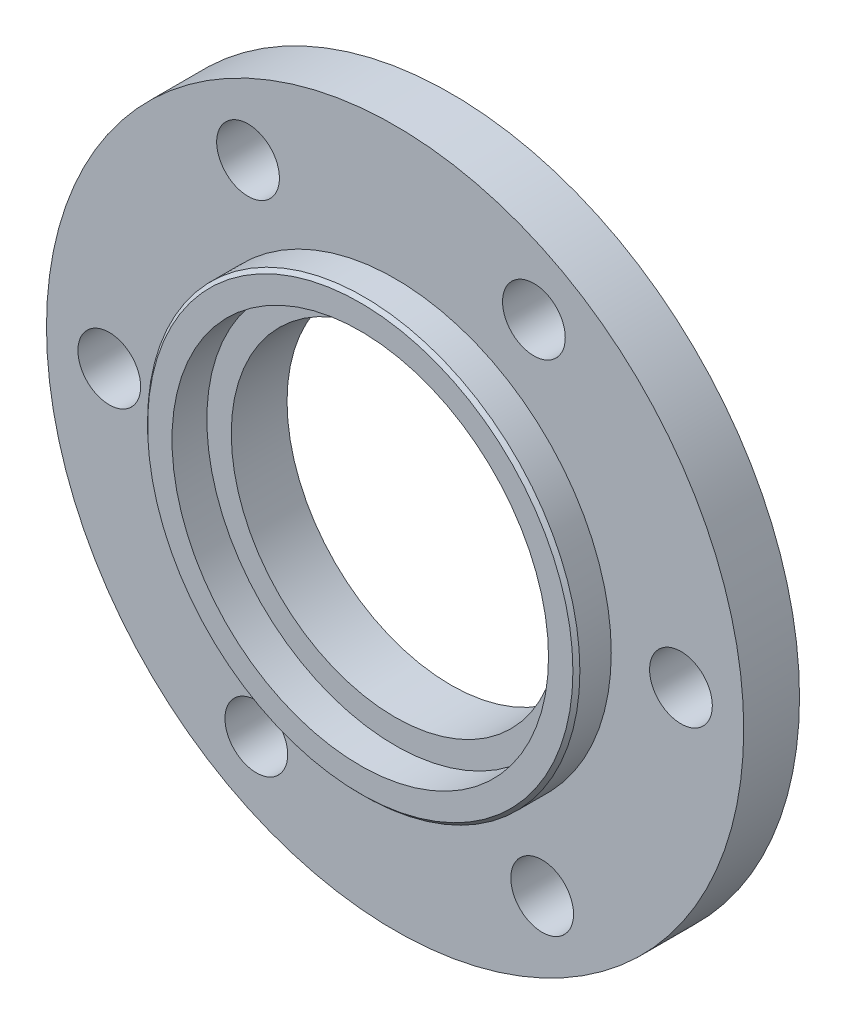
ISO-10303-21;
HEADER;
FILE_DESCRIPTION(('STEP AP214'),'2;1');
FILE_NAME('part.step','',(''),(''),'','','');
FILE_SCHEMA(('AUTOMOTIVE_DESIGN { 1 0 10303 214 1 1 1 1 }'));
ENDSEC;
DATA;
#1=APPLICATION_CONTEXT('core data for automotive mechanical design processes');
#2=APPLICATION_PROTOCOL_DEFINITION('international standard','automotive_design',2000,#1);
#3=PRODUCT_CONTEXT('',#1,'mechanical');
#4=PRODUCT('Part','Part','',(#3));
#5=PRODUCT_RELATED_PRODUCT_CATEGORY('part','',(#4));
#6=PRODUCT_DEFINITION_FORMATION('','',#4);
#7=PRODUCT_DEFINITION_CONTEXT('part definition',#1,'design');
#8=PRODUCT_DEFINITION('design','',#6,#7);
#9=PRODUCT_DEFINITION_SHAPE('','',#8);
#10=(LENGTH_UNIT() NAMED_UNIT(*) SI_UNIT(.MILLI.,.METRE.));
#11=(NAMED_UNIT(*) PLANE_ANGLE_UNIT() SI_UNIT($,.RADIAN.));
#12=(NAMED_UNIT(*) SI_UNIT($,.STERADIAN.) SOLID_ANGLE_UNIT());
#13=UNCERTAINTY_MEASURE_WITH_UNIT(LENGTH_MEASURE(1.E-05),#10,'distance_accuracy_value','');
#14=(GEOMETRIC_REPRESENTATION_CONTEXT(3) GLOBAL_UNCERTAINTY_ASSIGNED_CONTEXT((#13)) GLOBAL_UNIT_ASSIGNED_CONTEXT((#10,
#11,#12)) REPRESENTATION_CONTEXT('',''));
#15=CARTESIAN_POINT('',(0.,0.,0.));
#16=DIRECTION('',(0.,0.,1.));
#17=DIRECTION('',(1.,0.,0.));
#18=AXIS2_PLACEMENT_3D('',#15,#16,#17);
#19=CARTESIAN_POINT('',(0.,0.,8.));
#20=DIRECTION('',(0.,0.,-1.));
#21=DIRECTION('',(-1.,0.,0.));
#22=AXIS2_PLACEMENT_3D('',#19,#20,#21);
#23=CYLINDRICAL_SURFACE('',#22,50.);
#24=CARTESIAN_POINT('',(0.,0.,8.));
#25=DIRECTION('',(0.,0.,1.));
#26=DIRECTION('',(1.,0.,0.));
#27=AXIS2_PLACEMENT_3D('',#24,#25,#26);
#28=CIRCLE('',#27,50.);
#29=CARTESIAN_POINT('',(50.,0.,8.));
#30=VERTEX_POINT('',#29);
#31=EDGE_CURVE('E55',#30,#30,#28,.T.);
#32=ORIENTED_EDGE('',*,*,#31,.F.);
#33=EDGE_LOOP('',(#32));
#34=FACE_BOUND('',#33,.T.);
#35=CARTESIAN_POINT('',(0.,0.,0.));
#36=DIRECTION('',(0.,0.,1.));
#37=DIRECTION('',(1.,0.,0.));
#38=AXIS2_PLACEMENT_3D('',#35,#36,#37);
#39=CIRCLE('',#38,50.);
#40=CARTESIAN_POINT('',(50.,0.,0.));
#41=VERTEX_POINT('',#40);
#42=EDGE_CURVE('E58',#41,#41,#39,.T.);
#43=ORIENTED_EDGE('',*,*,#42,.T.);
#44=EDGE_LOOP('',(#43));
#45=FACE_BOUND('',#44,.T.);
#46=ADVANCED_FACE('F39',(#34,#45),#23,.T.);
#47=CARTESIAN_POINT('',(0.,0.,8.));
#48=DIRECTION('',(0.,0.,1.));
#49=DIRECTION('',(1.,0.,0.));
#50=AXIS2_PLACEMENT_3D('',#47,#48,#49);
#51=PLANE('',#50);
#52=CARTESIAN_POINT('',(40.9942813374193,0.684761001017027,8.));
#53=DIRECTION('',(0.,0.,1.));
#54=DIRECTION('',(1.,0.,0.));
#55=AXIS2_PLACEMENT_3D('',#52,#53,#54);
#56=CIRCLE('',#55,4.5);
#57=CARTESIAN_POINT('',(45.4942813374193,0.684761001017027,8.));
#58=VERTEX_POINT('',#57);
#59=EDGE_CURVE('E101',#58,#58,#56,.T.);
#60=ORIENTED_EDGE('',*,*,#59,.F.);
#61=EDGE_LOOP('',(#60));
#62=FACE_BOUND('',#61,.T.);
#63=CARTESIAN_POINT('',(19.9041202463085,35.8444695485997,8.));
#64=DIRECTION('',(0.,0.,1.));
#65=DIRECTION('',(1.,0.,0.));
#66=AXIS2_PLACEMENT_3D('',#63,#64,#65);
#67=CIRCLE('',#66,4.50000000000001);
#68=CARTESIAN_POINT('',(24.4041202463085,35.8444695485997,8.));
#69=VERTEX_POINT('',#68);
#70=EDGE_CURVE('E80',#69,#69,#67,.T.);
#71=ORIENTED_EDGE('',*,*,#70,.F.);
#72=EDGE_LOOP('',(#71));
#73=FACE_BOUND('',#72,.T.);
#74=CARTESIAN_POINT('',(-21.0901610911109,35.1597085475831,8.));
#75=DIRECTION('',(0.,0.,1.));
#76=DIRECTION('',(1.,0.,0.));
#77=AXIS2_PLACEMENT_3D('',#74,#75,#76);
#78=CIRCLE('',#77,4.5);
#79=CARTESIAN_POINT('',(-16.5901610911109,35.1597085475831,8.));
#80=VERTEX_POINT('',#79);
#81=EDGE_CURVE('E79',#80,#80,#78,.T.);
#82=ORIENTED_EDGE('',*,*,#81,.F.);
#83=EDGE_LOOP('',(#82));
#84=FACE_BOUND('',#83,.T.);
#85=CARTESIAN_POINT('',(-40.9942813374193,-0.684761001016741,8.));
#86=DIRECTION('',(0.,0.,1.));
#87=DIRECTION('',(1.,0.,0.));
#88=AXIS2_PLACEMENT_3D('',#85,#86,#87);
#89=CIRCLE('',#88,4.5);
#90=CARTESIAN_POINT('',(-36.4942813374193,-0.684761001016741,8.));
#91=VERTEX_POINT('',#90);
#92=EDGE_CURVE('E86',#91,#91,#89,.T.);
#93=ORIENTED_EDGE('',*,*,#92,.F.);
#94=EDGE_LOOP('',(#93));
#95=FACE_BOUND('',#94,.T.);
#96=CARTESIAN_POINT('',(-19.9041202463082,-35.8444695485999,8.));
#97=DIRECTION('',(0.,0.,1.));
#98=DIRECTION('',(1.,0.,0.));
#99=AXIS2_PLACEMENT_3D('',#96,#97,#98);
#100=CIRCLE('',#99,4.50000000000001);
#101=CARTESIAN_POINT('',(-15.4041202463082,-35.8444695485999,8.));
#102=VERTEX_POINT('',#101);
#103=EDGE_CURVE('E92',#102,#102,#100,.T.);
#104=ORIENTED_EDGE('',*,*,#103,.F.);
#105=EDGE_LOOP('',(#104));
#106=FACE_BOUND('',#105,.T.);
#107=CARTESIAN_POINT('',(21.0901610911112,-35.159708547583,8.));
#108=DIRECTION('',(0.,0.,1.));
#109=DIRECTION('',(1.,0.,0.));
#110=AXIS2_PLACEMENT_3D('',#107,#108,#109);
#111=CIRCLE('',#110,4.50000000000001);
#112=CARTESIAN_POINT('',(25.5901610911112,-35.159708547583,8.));
#113=VERTEX_POINT('',#112);
#114=EDGE_CURVE('E98',#113,#113,#111,.T.);
#115=ORIENTED_EDGE('',*,*,#114,.F.);
#116=EDGE_LOOP('',(#115));
#117=FACE_BOUND('',#116,.T.);
#118=CARTESIAN_POINT('',(0.,0.,8.));
#119=DIRECTION('',(0.,0.,1.));
#120=DIRECTION('',(1.,0.,0.));
#121=AXIS2_PLACEMENT_3D('',#118,#119,#120);
#122=CIRCLE('',#121,31.);
#123=CARTESIAN_POINT('',(31.,0.,8.));
#124=VERTEX_POINT('',#123);
#125=EDGE_CURVE('E51',#124,#124,#122,.T.);
#126=ORIENTED_EDGE('',*,*,#125,.F.);
#127=EDGE_LOOP('',(#126));
#128=FACE_BOUND('',#127,.T.);
#129=ORIENTED_EDGE('',*,*,#31,.T.);
#130=EDGE_LOOP('',(#129));
#131=FACE_BOUND('',#130,.T.);
#132=ADVANCED_FACE('F122',(#62,#73,#84,#95,#106,#117,#128,#131),#51,.T.);
#133=CARTESIAN_POINT('',(0.,0.,0.));
#134=DIRECTION('',(0.,0.,1.));
#135=DIRECTION('',(1.,0.,0.));
#136=AXIS2_PLACEMENT_3D('',#133,#134,#135);
#137=PLANE('',#136);
#138=CARTESIAN_POINT('',(40.9942813374193,0.684761001017027,0.));
#139=DIRECTION('',(0.,0.,1.));
#140=DIRECTION('',(1.,0.,0.));
#141=AXIS2_PLACEMENT_3D('',#138,#139,#140);
#142=CIRCLE('',#141,4.5);
#143=CARTESIAN_POINT('',(45.4942813374193,0.684761001017027,0.));
#144=VERTEX_POINT('',#143);
#145=EDGE_CURVE('E73',#144,#144,#142,.T.);
#146=ORIENTED_EDGE('',*,*,#145,.T.);
#147=EDGE_LOOP('',(#146));
#148=FACE_BOUND('',#147,.T.);
#149=CARTESIAN_POINT('',(19.9041202463085,35.8444695485997,0.));
#150=DIRECTION('',(0.,0.,1.));
#151=DIRECTION('',(1.,0.,0.));
#152=AXIS2_PLACEMENT_3D('',#149,#150,#151);
#153=CIRCLE('',#152,4.50000000000001);
#154=CARTESIAN_POINT('',(24.4041202463085,35.8444695485997,0.));
#155=VERTEX_POINT('',#154);
#156=EDGE_CURVE('E102',#155,#155,#153,.T.);
#157=ORIENTED_EDGE('',*,*,#156,.T.);
#158=EDGE_LOOP('',(#157));
#159=FACE_BOUND('',#158,.T.);
#160=CARTESIAN_POINT('',(-21.0901610911109,35.1597085475831,0.));
#161=DIRECTION('',(0.,0.,1.));
#162=DIRECTION('',(1.,0.,0.));
#163=AXIS2_PLACEMENT_3D('',#160,#161,#162);
#164=CIRCLE('',#163,4.5);
#165=CARTESIAN_POINT('',(-16.5901610911109,35.1597085475831,0.));
#166=VERTEX_POINT('',#165);
#167=EDGE_CURVE('E76',#166,#166,#164,.T.);
#168=ORIENTED_EDGE('',*,*,#167,.T.);
#169=EDGE_LOOP('',(#168));
#170=FACE_BOUND('',#169,.T.);
#171=CARTESIAN_POINT('',(-40.9942813374193,-0.684761001016741,0.));
#172=DIRECTION('',(0.,0.,1.));
#173=DIRECTION('',(1.,0.,0.));
#174=AXIS2_PLACEMENT_3D('',#171,#172,#173);
#175=CIRCLE('',#174,4.5);
#176=CARTESIAN_POINT('',(-36.4942813374193,-0.684761001016741,0.));
#177=VERTEX_POINT('',#176);
#178=EDGE_CURVE('E83',#177,#177,#175,.T.);
#179=ORIENTED_EDGE('',*,*,#178,.T.);
#180=EDGE_LOOP('',(#179));
#181=FACE_BOUND('',#180,.T.);
#182=CARTESIAN_POINT('',(-19.9041202463082,-35.8444695485999,0.));
#183=DIRECTION('',(0.,0.,1.));
#184=DIRECTION('',(1.,0.,0.));
#185=AXIS2_PLACEMENT_3D('',#182,#183,#184);
#186=CIRCLE('',#185,4.50000000000001);
#187=CARTESIAN_POINT('',(-15.4041202463082,-35.8444695485999,0.));
#188=VERTEX_POINT('',#187);
#189=EDGE_CURVE('E89',#188,#188,#186,.T.);
#190=ORIENTED_EDGE('',*,*,#189,.T.);
#191=EDGE_LOOP('',(#190));
#192=FACE_BOUND('',#191,.T.);
#193=CARTESIAN_POINT('',(21.0901610911112,-35.159708547583,0.));
#194=DIRECTION('',(0.,0.,1.));
#195=DIRECTION('',(1.,0.,0.));
#196=AXIS2_PLACEMENT_3D('',#193,#194,#195);
#197=CIRCLE('',#196,4.50000000000001);
#198=CARTESIAN_POINT('',(25.5901610911112,-35.159708547583,0.));
#199=VERTEX_POINT('',#198);
#200=EDGE_CURVE('E95',#199,#199,#197,.T.);
#201=ORIENTED_EDGE('',*,*,#200,.T.);
#202=EDGE_LOOP('',(#201));
#203=FACE_BOUND('',#202,.T.);
#204=CARTESIAN_POINT('',(0.,0.,0.));
#205=DIRECTION('',(0.,0.,1.));
#206=DIRECTION('',(1.,0.,0.));
#207=AXIS2_PLACEMENT_3D('',#204,#205,#206);
#208=CIRCLE('',#207,23.5);
#209=CARTESIAN_POINT('',(23.5,0.,0.));
#210=VERTEX_POINT('',#209);
#211=EDGE_CURVE('E67',#210,#210,#208,.T.);
#212=ORIENTED_EDGE('',*,*,#211,.T.);
#213=EDGE_LOOP('',(#212));
#214=FACE_BOUND('',#213,.T.);
#215=ORIENTED_EDGE('',*,*,#42,.F.);
#216=EDGE_LOOP('',(#215));
#217=FACE_BOUND('',#216,.T.);
#218=ADVANCED_FACE('F112',(#148,#159,#170,#181,#192,#203,#214,#217),#137,.F.);
#219=CARTESIAN_POINT('',(0.,0.,13.));
#220=DIRECTION('',(0.,0.,-1.));
#221=DIRECTION('',(-1.,0.,0.));
#222=AXIS2_PLACEMENT_3D('',#219,#220,#221);
#223=CYLINDRICAL_SURFACE('',#222,31.);
#224=CARTESIAN_POINT('',(0.,0.,12.5));
#225=DIRECTION('',(0.,0.,1.));
#226=DIRECTION('',(1.,0.,0.));
#227=AXIS2_PLACEMENT_3D('',#224,#225,#226);
#228=CIRCLE('',#227,31.);
#229=CARTESIAN_POINT('',(31.,0.,12.5));
#230=VERTEX_POINT('',#229);
#231=EDGE_CURVE('E10',#230,#230,#228,.F.);
#232=ORIENTED_EDGE('',*,*,#231,.T.);
#233=EDGE_LOOP('',(#232));
#234=FACE_BOUND('',#233,.T.);
#235=ORIENTED_EDGE('',*,*,#125,.T.);
#236=EDGE_LOOP('',(#235));
#237=FACE_BOUND('',#236,.T.);
#238=ADVANCED_FACE('F145',(#234,#237),#223,.T.);
#239=CARTESIAN_POINT('',(0.,0.,13.));
#240=DIRECTION('',(0.,0.,1.));
#241=DIRECTION('',(1.,0.,0.));
#242=AXIS2_PLACEMENT_3D('',#239,#240,#241);
#243=PLANE('',#242);
#244=CARTESIAN_POINT('',(0.,0.,13.));
#245=DIRECTION('',(0.,0.,1.));
#246=DIRECTION('',(1.,0.,0.));
#247=AXIS2_PLACEMENT_3D('',#244,#245,#246);
#248=CIRCLE('',#247,30.5);
#249=CARTESIAN_POINT('',(30.5,0.,13.));
#250=VERTEX_POINT('',#249);
#251=EDGE_CURVE('E47',#250,#250,#248,.T.);
#252=ORIENTED_EDGE('',*,*,#251,.T.);
#253=EDGE_LOOP('',(#252));
#254=FACE_BOUND('',#253,.T.);
#255=CARTESIAN_POINT('',(0.,0.,13.));
#256=DIRECTION('',(0.,0.,1.));
#257=DIRECTION('',(1.,0.,0.));
#258=AXIS2_PLACEMENT_3D('',#255,#256,#257);
#259=CIRCLE('',#258,27.);
#260=CARTESIAN_POINT('',(27.,0.,13.));
#261=VERTEX_POINT('',#260);
#262=EDGE_CURVE('E64',#261,#261,#259,.T.);
#263=ORIENTED_EDGE('',*,*,#262,.F.);
#264=EDGE_LOOP('',(#263));
#265=FACE_BOUND('',#264,.T.);
#266=ADVANCED_FACE('F150',(#254,#265),#243,.T.);
#267=CARTESIAN_POINT('',(0.,0.,8.));
#268=DIRECTION('',(0.,0.,1.));
#269=DIRECTION('',(1.,0.,0.));
#270=AXIS2_PLACEMENT_3D('',#267,#268,#269);
#271=CYLINDRICAL_SURFACE('',#270,27.);
#272=CARTESIAN_POINT('',(0.,0.,8.));
#273=DIRECTION('',(0.,0.,1.));
#274=DIRECTION('',(1.,0.,0.));
#275=AXIS2_PLACEMENT_3D('',#272,#273,#274);
#276=CIRCLE('',#275,27.);
#277=CARTESIAN_POINT('',(27.,0.,8.));
#278=VERTEX_POINT('',#277);
#279=EDGE_CURVE('E61',#278,#278,#276,.T.);
#280=ORIENTED_EDGE('',*,*,#279,.F.);
#281=EDGE_LOOP('',(#280));
#282=FACE_BOUND('',#281,.T.);
#283=ORIENTED_EDGE('',*,*,#262,.T.);
#284=EDGE_LOOP('',(#283));
#285=FACE_BOUND('',#284,.T.);
#286=ADVANCED_FACE('F155',(#282,#285),#271,.F.);
#287=CARTESIAN_POINT('',(0.,0.,8.));
#288=DIRECTION('',(0.,0.,1.));
#289=DIRECTION('',(1.,0.,0.));
#290=AXIS2_PLACEMENT_3D('',#287,#288,#289);
#291=PLANE('',#290);
#292=CARTESIAN_POINT('',(0.,0.,8.));
#293=DIRECTION('',(0.,0.,1.));
#294=DIRECTION('',(1.,0.,0.));
#295=AXIS2_PLACEMENT_3D('',#292,#293,#294);
#296=CIRCLE('',#295,23.5);
#297=CARTESIAN_POINT('',(23.5,0.,8.));
#298=VERTEX_POINT('',#297);
#299=EDGE_CURVE('E70',#298,#298,#296,.T.);
#300=ORIENTED_EDGE('',*,*,#299,.F.);
#301=EDGE_LOOP('',(#300));
#302=FACE_BOUND('',#301,.T.);
#303=ORIENTED_EDGE('',*,*,#279,.T.);
#304=EDGE_LOOP('',(#303));
#305=FACE_BOUND('',#304,.T.);
#306=ADVANCED_FACE('F158',(#302,#305),#291,.T.);
#307=CARTESIAN_POINT('',(0.,0.,0.));
#308=DIRECTION('',(0.,0.,1.));
#309=DIRECTION('',(1.,0.,0.));
#310=AXIS2_PLACEMENT_3D('',#307,#308,#309);
#311=CYLINDRICAL_SURFACE('',#310,23.5);
#312=ORIENTED_EDGE('',*,*,#211,.F.);
#313=EDGE_LOOP('',(#312));
#314=FACE_BOUND('',#313,.T.);
#315=ORIENTED_EDGE('',*,*,#299,.T.);
#316=EDGE_LOOP('',(#315));
#317=FACE_BOUND('',#316,.T.);
#318=ADVANCED_FACE('F162',(#314,#317),#311,.F.);
#319=CARTESIAN_POINT('',(21.0901610911112,-35.159708547583,0.));
#320=DIRECTION('',(0.,0.,1.));
#321=DIRECTION('',(1.,0.,0.));
#322=AXIS2_PLACEMENT_3D('',#319,#320,#321);
#323=CYLINDRICAL_SURFACE('',#322,4.50000000000001);
#324=ORIENTED_EDGE('',*,*,#200,.F.);
#325=EDGE_LOOP('',(#324));
#326=FACE_BOUND('',#325,.T.);
#327=ORIENTED_EDGE('',*,*,#114,.T.);
#328=EDGE_LOOP('',(#327));
#329=FACE_BOUND('',#328,.T.);
#330=ADVANCED_FACE('F166',(#326,#329),#323,.F.);
#331=CARTESIAN_POINT('',(-19.9041202463082,-35.8444695485999,0.));
#332=DIRECTION('',(0.,0.,1.));
#333=DIRECTION('',(1.,0.,0.));
#334=AXIS2_PLACEMENT_3D('',#331,#332,#333);
#335=CYLINDRICAL_SURFACE('',#334,4.50000000000001);
#336=ORIENTED_EDGE('',*,*,#189,.F.);
#337=EDGE_LOOP('',(#336));
#338=FACE_BOUND('',#337,.T.);
#339=ORIENTED_EDGE('',*,*,#103,.T.);
#340=EDGE_LOOP('',(#339));
#341=FACE_BOUND('',#340,.T.);
#342=ADVANCED_FACE('F175',(#338,#341),#335,.F.);
#343=CARTESIAN_POINT('',(-40.9942813374193,-0.684761001016741,0.));
#344=DIRECTION('',(0.,0.,1.));
#345=DIRECTION('',(1.,0.,0.));
#346=AXIS2_PLACEMENT_3D('',#343,#344,#345);
#347=CYLINDRICAL_SURFACE('',#346,4.5);
#348=ORIENTED_EDGE('',*,*,#178,.F.);
#349=EDGE_LOOP('',(#348));
#350=FACE_BOUND('',#349,.T.);
#351=ORIENTED_EDGE('',*,*,#92,.T.);
#352=EDGE_LOOP('',(#351));
#353=FACE_BOUND('',#352,.T.);
#354=ADVANCED_FACE('F171',(#350,#353),#347,.F.);
#355=CARTESIAN_POINT('',(-21.0901610911109,35.1597085475831,0.));
#356=DIRECTION('',(0.,0.,1.));
#357=DIRECTION('',(1.,0.,0.));
#358=AXIS2_PLACEMENT_3D('',#355,#356,#357);
#359=CYLINDRICAL_SURFACE('',#358,4.5);
#360=ORIENTED_EDGE('',*,*,#167,.F.);
#361=EDGE_LOOP('',(#360));
#362=FACE_BOUND('',#361,.T.);
#363=ORIENTED_EDGE('',*,*,#81,.T.);
#364=EDGE_LOOP('',(#363));
#365=FACE_BOUND('',#364,.T.);
#366=ADVANCED_FACE('F168',(#362,#365),#359,.F.);
#367=CARTESIAN_POINT('',(19.9041202463085,35.8444695485997,0.));
#368=DIRECTION('',(0.,0.,1.));
#369=DIRECTION('',(1.,0.,0.));
#370=AXIS2_PLACEMENT_3D('',#367,#368,#369);
#371=CYLINDRICAL_SURFACE('',#370,4.50000000000001);
#372=ORIENTED_EDGE('',*,*,#156,.F.);
#373=EDGE_LOOP('',(#372));
#374=FACE_BOUND('',#373,.T.);
#375=ORIENTED_EDGE('',*,*,#70,.T.);
#376=EDGE_LOOP('',(#375));
#377=FACE_BOUND('',#376,.T.);
#378=ADVANCED_FACE('F118',(#374,#377),#371,.F.);
#379=CARTESIAN_POINT('',(40.9942813374193,0.684761001017027,0.));
#380=DIRECTION('',(0.,0.,1.));
#381=DIRECTION('',(1.,0.,0.));
#382=AXIS2_PLACEMENT_3D('',#379,#380,#381);
#383=CYLINDRICAL_SURFACE('',#382,4.5);
#384=ORIENTED_EDGE('',*,*,#145,.F.);
#385=EDGE_LOOP('',(#384));
#386=FACE_BOUND('',#385,.T.);
#387=ORIENTED_EDGE('',*,*,#59,.T.);
#388=EDGE_LOOP('',(#387));
#389=FACE_BOUND('',#388,.T.);
#390=ADVANCED_FACE('F115',(#386,#389),#383,.F.);
#391=CARTESIAN_POINT('',(0.,0.,13.));
#392=DIRECTION('',(0.,0.,-1.));
#393=DIRECTION('',(-1.,0.,0.));
#394=AXIS2_PLACEMENT_3D('',#391,#392,#393);
#395=CONICAL_SURFACE('',#394,30.5,0.785398163397448);
#396=ORIENTED_EDGE('',*,*,#231,.F.);
#397=EDGE_LOOP('',(#396));
#398=FACE_BOUND('',#397,.T.);
#399=ORIENTED_EDGE('',*,*,#251,.F.);
#400=EDGE_LOOP('',(#399));
#401=FACE_BOUND('',#400,.T.);
#402=ADVANCED_FACE('F42',(#398,#401),#395,.T.);
#403=CLOSED_SHELL('',(#46,#132,#218,#238,#266,#286,#306,#318,#330,#342,#354,#366,#378,#390,#402));
#404=MANIFOLD_SOLID_BREP('B2',#403);
#405=ADVANCED_BREP_SHAPE_REPRESENTATION('',(#18,#404),#14);
#406=SHAPE_DEFINITION_REPRESENTATION(#9,#405);
ENDSEC;
END-ISO-10303-21;
